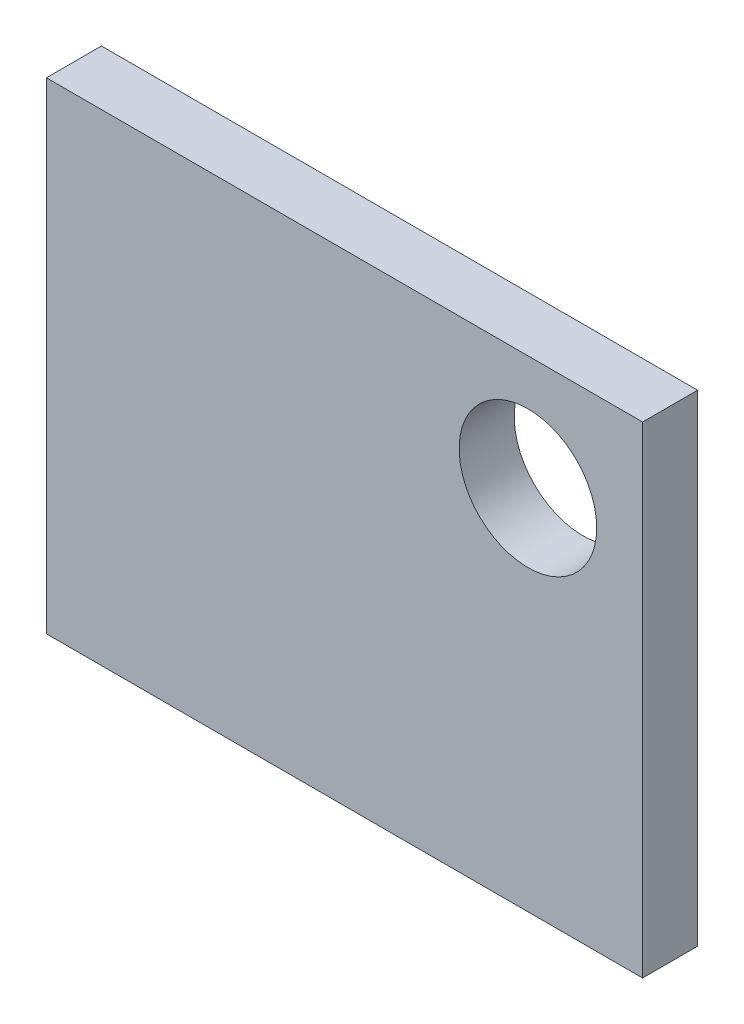
ISO-10303-21;
HEADER;
FILE_DESCRIPTION(('STEP AP214'),'2;1');
FILE_NAME('part.step','',(''),(''),'','','');
FILE_SCHEMA(('AUTOMOTIVE_DESIGN { 1 0 10303 214 1 1 1 1 }'));
ENDSEC;
DATA;
#1=APPLICATION_CONTEXT('core data for automotive mechanical design processes');
#2=APPLICATION_PROTOCOL_DEFINITION('international standard','automotive_design',2000,#1);
#3=PRODUCT_CONTEXT('',#1,'mechanical');
#4=PRODUCT('Part','Part','',(#3));
#5=PRODUCT_RELATED_PRODUCT_CATEGORY('part','',(#4));
#6=PRODUCT_DEFINITION_FORMATION('','',#4);
#7=PRODUCT_DEFINITION_CONTEXT('part definition',#1,'design');
#8=PRODUCT_DEFINITION('design','',#6,#7);
#9=PRODUCT_DEFINITION_SHAPE('','',#8);
#10=(LENGTH_UNIT() NAMED_UNIT(*) SI_UNIT(.MILLI.,.METRE.));
#11=(NAMED_UNIT(*) PLANE_ANGLE_UNIT() SI_UNIT($,.RADIAN.));
#12=(NAMED_UNIT(*) SI_UNIT($,.STERADIAN.) SOLID_ANGLE_UNIT());
#13=UNCERTAINTY_MEASURE_WITH_UNIT(LENGTH_MEASURE(1.E-05),#10,'distance_accuracy_value','');
#14=(GEOMETRIC_REPRESENTATION_CONTEXT(3) GLOBAL_UNCERTAINTY_ASSIGNED_CONTEXT((#13)) GLOBAL_UNIT_ASSIGNED_CONTEXT((#10,
#11,#12)) REPRESENTATION_CONTEXT('',''));
#15=CARTESIAN_POINT('',(0.,0.,0.));
#16=DIRECTION('',(0.,0.,1.));
#17=DIRECTION('',(1.,0.,0.));
#18=AXIS2_PLACEMENT_3D('',#15,#16,#17);
#19=CARTESIAN_POINT('',(-5.,5.,1.2));
#20=DIRECTION('',(1.,0.,0.));
#21=DIRECTION('',(0.,1.,0.));
#22=AXIS2_PLACEMENT_3D('',#19,#20,#21);
#23=PLANE('',#22);
#24=DIRECTION('',(0.,-1.,0.));
#25=VECTOR('',#24,1.);
#26=CARTESIAN_POINT('',(-5.,5.,0.));
#27=LINE('',#26,#25);
#28=CARTESIAN_POINT('',(-5.,5.,0.));
#29=VERTEX_POINT('',#28);
#30=CARTESIAN_POINT('',(-5.,-5.5,0.));
#31=VERTEX_POINT('',#30);
#32=EDGE_CURVE('E95',#29,#31,#27,.T.);
#33=ORIENTED_EDGE('',*,*,#32,.T.);
#34=DIRECTION('',(0.,0.,-1.));
#35=VECTOR('',#34,1.);
#36=CARTESIAN_POINT('',(-5.,-5.5,1.2));
#37=LINE('',#36,#35);
#38=CARTESIAN_POINT('',(-5.,-5.5,1.2));
#39=VERTEX_POINT('',#38);
#40=EDGE_CURVE('E11',#39,#31,#37,.T.);
#41=ORIENTED_EDGE('',*,*,#40,.F.);
#42=DIRECTION('',(0.,-1.,0.));
#43=VECTOR('',#42,1.);
#44=CARTESIAN_POINT('',(-5.,5.,1.2));
#45=LINE('',#44,#43);
#46=CARTESIAN_POINT('',(-5.,5.,1.2));
#47=VERTEX_POINT('',#46);
#48=EDGE_CURVE('E83',#47,#39,#45,.T.);
#49=ORIENTED_EDGE('',*,*,#48,.F.);
#50=DIRECTION('',(0.,0.,-1.));
#51=VECTOR('',#50,1.);
#52=CARTESIAN_POINT('',(-5.,5.,1.2));
#53=LINE('',#52,#51);
#54=EDGE_CURVE('E91',#47,#29,#53,.T.);
#55=ORIENTED_EDGE('',*,*,#54,.T.);
#56=EDGE_LOOP('',(#33,#41,#49,#55));
#57=FACE_BOUND('',#56,.T.);
#58=ADVANCED_FACE('F32',(#57),#23,.F.);
#59=CARTESIAN_POINT('',(-5.,-5.5,1.2));
#60=DIRECTION('',(0.,1.,0.));
#61=DIRECTION('',(0.,0.,1.));
#62=AXIS2_PLACEMENT_3D('',#59,#60,#61);
#63=PLANE('',#62);
#64=DIRECTION('',(1.,0.,0.));
#65=VECTOR('',#64,1.);
#66=CARTESIAN_POINT('',(-5.,-5.5,0.));
#67=LINE('',#66,#65);
#68=CARTESIAN_POINT('',(8.,-5.5,0.));
#69=VERTEX_POINT('',#68);
#70=EDGE_CURVE('E87',#31,#69,#67,.T.);
#71=ORIENTED_EDGE('',*,*,#70,.T.);
#72=DIRECTION('',(0.,0.,-1.));
#73=VECTOR('',#72,1.);
#74=CARTESIAN_POINT('',(8.,-5.5,1.2));
#75=LINE('',#74,#73);
#76=CARTESIAN_POINT('',(8.,-5.5,1.2));
#77=VERTEX_POINT('',#76);
#78=EDGE_CURVE('E40',#77,#69,#75,.T.);
#79=ORIENTED_EDGE('',*,*,#78,.F.);
#80=DIRECTION('',(1.,0.,0.));
#81=VECTOR('',#80,1.);
#82=CARTESIAN_POINT('',(-5.,-5.5,1.2));
#83=LINE('',#82,#81);
#84=EDGE_CURVE('E78',#39,#77,#83,.T.);
#85=ORIENTED_EDGE('',*,*,#84,.F.);
#86=ORIENTED_EDGE('',*,*,#40,.T.);
#87=EDGE_LOOP('',(#71,#79,#85,#86));
#88=FACE_BOUND('',#87,.T.);
#89=ADVANCED_FACE('F86',(#88),#63,.F.);
#90=CARTESIAN_POINT('',(8.,5.,1.2));
#91=DIRECTION('',(-1.,0.,0.));
#92=DIRECTION('',(0.,-1.,0.));
#93=AXIS2_PLACEMENT_3D('',#90,#91,#92);
#94=PLANE('',#93);
#95=DIRECTION('',(0.,1.,0.));
#96=VECTOR('',#95,1.);
#97=CARTESIAN_POINT('',(8.,5.,0.));
#98=LINE('',#97,#96);
#99=CARTESIAN_POINT('',(8.,5.,0.));
#100=VERTEX_POINT('',#99);
#101=EDGE_CURVE('E65',#69,#100,#98,.T.);
#102=ORIENTED_EDGE('',*,*,#101,.T.);
#103=DIRECTION('',(0.,0.,-1.));
#104=VECTOR('',#103,1.);
#105=CARTESIAN_POINT('',(8.,5.,1.2));
#106=LINE('',#105,#104);
#107=CARTESIAN_POINT('',(8.,5.,1.2));
#108=VERTEX_POINT('',#107);
#109=EDGE_CURVE('E88',#108,#100,#106,.T.);
#110=ORIENTED_EDGE('',*,*,#109,.F.);
#111=DIRECTION('',(0.,1.,0.));
#112=VECTOR('',#111,1.);
#113=CARTESIAN_POINT('',(8.,5.,1.2));
#114=LINE('',#113,#112);
#115=EDGE_CURVE('E81',#77,#108,#114,.T.);
#116=ORIENTED_EDGE('',*,*,#115,.F.);
#117=ORIENTED_EDGE('',*,*,#78,.T.);
#118=EDGE_LOOP('',(#102,#110,#116,#117));
#119=FACE_BOUND('',#118,.T.);
#120=ADVANCED_FACE('F89',(#119),#94,.F.);
#121=CARTESIAN_POINT('',(-5.,5.,1.2));
#122=DIRECTION('',(0.,-1.,0.));
#123=DIRECTION('',(0.,0.,-1.));
#124=AXIS2_PLACEMENT_3D('',#121,#122,#123);
#125=PLANE('',#124);
#126=DIRECTION('',(-1.,0.,0.));
#127=VECTOR('',#126,1.);
#128=CARTESIAN_POINT('',(-5.,5.,0.));
#129=LINE('',#128,#127);
#130=EDGE_CURVE('E71',#100,#29,#129,.T.);
#131=ORIENTED_EDGE('',*,*,#130,.T.);
#132=ORIENTED_EDGE('',*,*,#54,.F.);
#133=DIRECTION('',(-1.,0.,0.));
#134=VECTOR('',#133,1.);
#135=CARTESIAN_POINT('',(-5.,5.,1.2));
#136=LINE('',#135,#134);
#137=EDGE_CURVE('E48',#108,#47,#136,.T.);
#138=ORIENTED_EDGE('',*,*,#137,.F.);
#139=ORIENTED_EDGE('',*,*,#109,.T.);
#140=EDGE_LOOP('',(#131,#132,#138,#139));
#141=FACE_BOUND('',#140,.T.);
#142=ADVANCED_FACE('F103',(#141),#125,.F.);
#143=CARTESIAN_POINT('',(0.,0.,1.2));
#144=DIRECTION('',(0.,0.,1.));
#145=DIRECTION('',(1.,0.,0.));
#146=AXIS2_PLACEMENT_3D('',#143,#144,#145);
#147=PLANE('',#146);
#148=CARTESIAN_POINT('',(5.5,2.5,1.2));
#149=DIRECTION('',(0.,0.,1.));
#150=DIRECTION('',(1.,0.,0.));
#151=AXIS2_PLACEMENT_3D('',#148,#149,#150);
#152=CIRCLE('',#151,1.5);
#153=CARTESIAN_POINT('',(7.,2.5,1.2));
#154=VERTEX_POINT('',#153);
#155=EDGE_CURVE('E109',#154,#154,#152,.T.);
#156=ORIENTED_EDGE('',*,*,#155,.F.);
#157=EDGE_LOOP('',(#156));
#158=FACE_BOUND('',#157,.T.);
#159=ORIENTED_EDGE('',*,*,#48,.T.);
#160=ORIENTED_EDGE('',*,*,#84,.T.);
#161=ORIENTED_EDGE('',*,*,#115,.T.);
#162=ORIENTED_EDGE('',*,*,#137,.T.);
#163=EDGE_LOOP('',(#159,#160,#161,#162));
#164=FACE_BOUND('',#163,.T.);
#165=ADVANCED_FACE('F79',(#158,#164),#147,.T.);
#166=CARTESIAN_POINT('',(0.,0.,0.));
#167=DIRECTION('',(0.,0.,1.));
#168=DIRECTION('',(1.,0.,0.));
#169=AXIS2_PLACEMENT_3D('',#166,#167,#168);
#170=PLANE('',#169);
#171=CARTESIAN_POINT('',(5.5,2.5,0.));
#172=DIRECTION('',(0.,0.,1.));
#173=DIRECTION('',(1.,0.,0.));
#174=AXIS2_PLACEMENT_3D('',#171,#172,#173);
#175=CIRCLE('',#174,1.5);
#176=CARTESIAN_POINT('',(7.,2.5,0.));
#177=VERTEX_POINT('',#176);
#178=EDGE_CURVE('E98',#177,#177,#175,.T.);
#179=ORIENTED_EDGE('',*,*,#178,.T.);
#180=EDGE_LOOP('',(#179));
#181=FACE_BOUND('',#180,.T.);
#182=ORIENTED_EDGE('',*,*,#32,.F.);
#183=ORIENTED_EDGE('',*,*,#130,.F.);
#184=ORIENTED_EDGE('',*,*,#101,.F.);
#185=ORIENTED_EDGE('',*,*,#70,.F.);
#186=EDGE_LOOP('',(#182,#183,#184,#185));
#187=FACE_BOUND('',#186,.T.);
#188=ADVANCED_FACE('F106',(#181,#187),#170,.F.);
#189=CARTESIAN_POINT('',(5.5,2.5,0.));
#190=DIRECTION('',(0.,0.,1.));
#191=DIRECTION('',(1.,0.,0.));
#192=AXIS2_PLACEMENT_3D('',#189,#190,#191);
#193=CYLINDRICAL_SURFACE('',#192,1.5);
#194=ORIENTED_EDGE('',*,*,#178,.F.);
#195=EDGE_LOOP('',(#194));
#196=FACE_BOUND('',#195,.T.);
#197=ORIENTED_EDGE('',*,*,#155,.T.);
#198=EDGE_LOOP('',(#197));
#199=FACE_BOUND('',#198,.T.);
#200=ADVANCED_FACE('F116',(#196,#199),#193,.F.);
#201=CLOSED_SHELL('',(#58,#89,#120,#142,#165,#188,#200));
#202=MANIFOLD_SOLID_BREP('B2',#201);
#203=ADVANCED_BREP_SHAPE_REPRESENTATION('',(#18,#202),#14);
#204=SHAPE_DEFINITION_REPRESENTATION(#9,#203);
ENDSEC;
END-ISO-10303-21;
